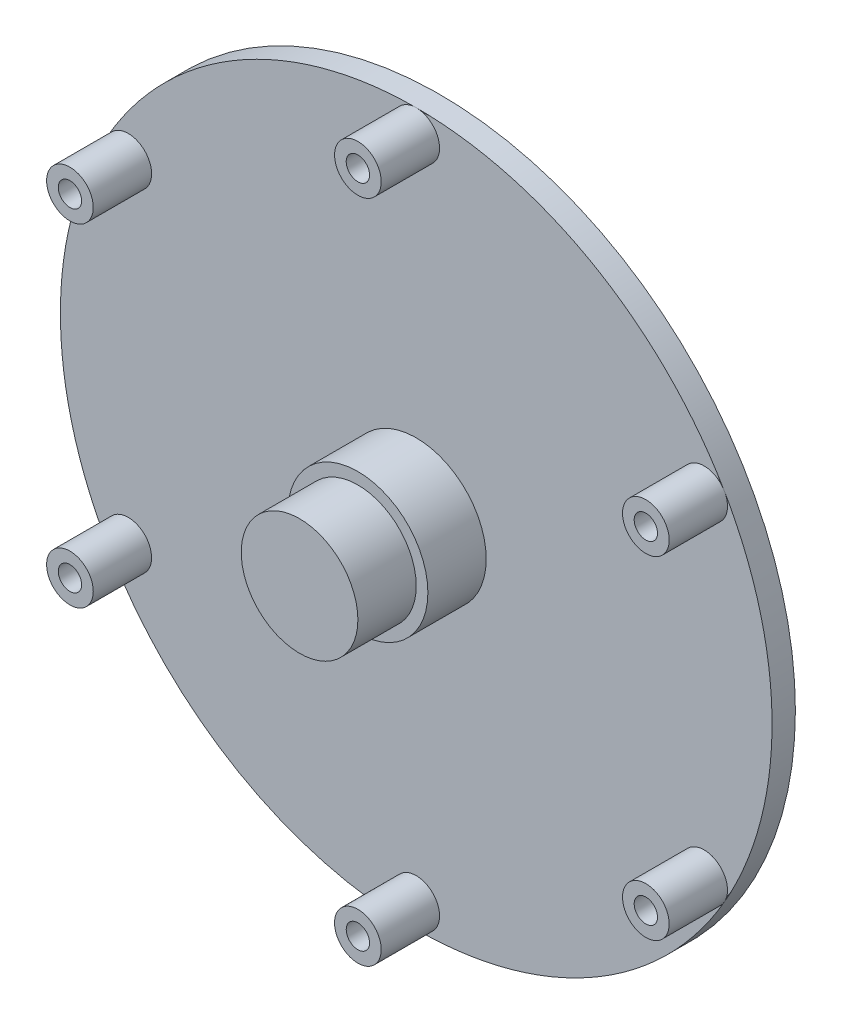
ISO-10303-21;
HEADER;
FILE_DESCRIPTION(('STEP AP214'),'2;1');
FILE_NAME('part.step','',(''),(''),'','','');
FILE_SCHEMA(('AUTOMOTIVE_DESIGN { 1 0 10303 214 1 1 1 1 }'));
ENDSEC;
DATA;
#1=APPLICATION_CONTEXT('core data for automotive mechanical design processes');
#2=APPLICATION_PROTOCOL_DEFINITION('international standard','automotive_design',2000,#1);
#3=PRODUCT_CONTEXT('',#1,'mechanical');
#4=PRODUCT('Part','Part','',(#3));
#5=PRODUCT_RELATED_PRODUCT_CATEGORY('part','',(#4));
#6=PRODUCT_DEFINITION_FORMATION('','',#4);
#7=PRODUCT_DEFINITION_CONTEXT('part definition',#1,'design');
#8=PRODUCT_DEFINITION('design','',#6,#7);
#9=PRODUCT_DEFINITION_SHAPE('','',#8);
#10=(LENGTH_UNIT() NAMED_UNIT(*) SI_UNIT(.MILLI.,.METRE.));
#11=(NAMED_UNIT(*) PLANE_ANGLE_UNIT() SI_UNIT($,.RADIAN.));
#12=(NAMED_UNIT(*) SI_UNIT($,.STERADIAN.) SOLID_ANGLE_UNIT());
#13=UNCERTAINTY_MEASURE_WITH_UNIT(LENGTH_MEASURE(1.E-05),#10,'distance_accuracy_value','');
#14=(GEOMETRIC_REPRESENTATION_CONTEXT(3) GLOBAL_UNCERTAINTY_ASSIGNED_CONTEXT((#13)) GLOBAL_UNIT_ASSIGNED_CONTEXT((#10,
#11,#12)) REPRESENTATION_CONTEXT('',''));
#15=CARTESIAN_POINT('',(0.,0.,0.));
#16=DIRECTION('',(0.,0.,1.));
#17=DIRECTION('',(1.,0.,0.));
#18=AXIS2_PLACEMENT_3D('',#15,#16,#17);
#19=CARTESIAN_POINT('',(0.,0.,2.));
#20=DIRECTION('',(0.,0.,1.));
#21=DIRECTION('',(1.,0.,0.));
#22=AXIS2_PLACEMENT_3D('',#19,#20,#21);
#23=PLANE('',#22);
#24=CARTESIAN_POINT('',(0.,0.,2.));
#25=DIRECTION('',(0.,0.,1.));
#26=DIRECTION('',(1.,0.,0.));
#27=AXIS2_PLACEMENT_3D('',#24,#25,#26);
#28=CIRCLE('',#27,6.);
#29=CARTESIAN_POINT('',(6.,0.,2.));
#30=VERTEX_POINT('',#29);
#31=EDGE_CURVE('E321',#30,#30,#28,.T.);
#32=ORIENTED_EDGE('',*,*,#31,.F.);
#33=EDGE_LOOP('',(#32));
#34=FACE_BOUND('',#33,.T.);
#35=CARTESIAN_POINT('',(0.,0.,2.));
#36=DIRECTION('',(0.,0.,1.));
#37=DIRECTION('',(1.,0.,0.));
#38=AXIS2_PLACEMENT_3D('',#35,#36,#37);
#39=CIRCLE('',#38,30.5);
#40=CARTESIAN_POINT('',(0.,30.5,2.));
#41=VERTEX_POINT('',#40);
#42=CARTESIAN_POINT('',(-26.4137748154252,15.2500000000003,2.));
#43=VERTEX_POINT('',#42);
#44=EDGE_CURVE('E122',#41,#43,#39,.T.);
#45=ORIENTED_EDGE('',*,*,#44,.T.);
#46=CARTESIAN_POINT('',(-24.6817240078563,14.2500000000003,2.));
#47=DIRECTION('',(0.,0.,1.));
#48=DIRECTION('',(0.50000000000001,0.866025403784433,0.));
#49=AXIS2_PLACEMENT_3D('',#46,#47,#48);
#50=CIRCLE('',#49,2.);
#51=EDGE_CURVE('E88',#43,#43,#50,.T.);
#52=ORIENTED_EDGE('',*,*,#51,.F.);
#53=CARTESIAN_POINT('',(-26.4137748154255,-15.2499999999998,2.));
#54=VERTEX_POINT('',#53);
#55=EDGE_CURVE('E94',#43,#54,#39,.T.);
#56=ORIENTED_EDGE('',*,*,#55,.T.);
#57=CARTESIAN_POINT('',(-24.6817240078566,-14.2499999999998,2.));
#58=DIRECTION('',(0.,0.,1.));
#59=DIRECTION('',(-0.499999999999992,0.866025403784443,0.));
#60=AXIS2_PLACEMENT_3D('',#57,#58,#59);
#61=CIRCLE('',#60,2.);
#62=EDGE_CURVE('E182',#54,#54,#61,.T.);
#63=ORIENTED_EDGE('',*,*,#62,.F.);
#64=CARTESIAN_POINT('',(0.,-30.5,2.));
#65=VERTEX_POINT('',#64);
#66=EDGE_CURVE('E617',#54,#65,#39,.T.);
#67=ORIENTED_EDGE('',*,*,#66,.T.);
#68=CARTESIAN_POINT('',(0.,-28.5,2.));
#69=DIRECTION('',(0.,0.,1.));
#70=DIRECTION('',(-1.,0.,0.));
#71=AXIS2_PLACEMENT_3D('',#68,#69,#70);
#72=CIRCLE('',#71,2.);
#73=EDGE_CURVE('E193',#65,#65,#72,.T.);
#74=ORIENTED_EDGE('',*,*,#73,.F.);
#75=CARTESIAN_POINT('',(26.4137748154253,-15.2500000000001,2.));
#76=VERTEX_POINT('',#75);
#77=EDGE_CURVE('E616',#65,#76,#39,.T.);
#78=ORIENTED_EDGE('',*,*,#77,.T.);
#79=CARTESIAN_POINT('',(24.6817240078564,-14.2500000000001,2.));
#80=DIRECTION('',(0.,0.,1.));
#81=DIRECTION('',(-0.500000000000004,-0.866025403784436,0.));
#82=AXIS2_PLACEMENT_3D('',#79,#80,#81);
#83=CIRCLE('',#82,2.);
#84=EDGE_CURVE('E205',#76,#76,#83,.T.);
#85=ORIENTED_EDGE('',*,*,#84,.F.);
#86=CARTESIAN_POINT('',(26.4137748154254,15.2499999999999,2.));
#87=VERTEX_POINT('',#86);
#88=EDGE_CURVE('E119',#76,#87,#39,.T.);
#89=ORIENTED_EDGE('',*,*,#88,.T.);
#90=CARTESIAN_POINT('',(24.6817240078565,14.2499999999999,2.));
#91=DIRECTION('',(0.,0.,1.));
#92=DIRECTION('',(0.499999999999998,-0.86602540378444,0.));
#93=AXIS2_PLACEMENT_3D('',#90,#91,#92);
#94=CIRCLE('',#93,2.);
#95=EDGE_CURVE('E116',#87,#87,#94,.T.);
#96=ORIENTED_EDGE('',*,*,#95,.F.);
#97=EDGE_CURVE('E110',#87,#41,#39,.T.);
#98=ORIENTED_EDGE('',*,*,#97,.T.);
#99=CARTESIAN_POINT('',(0.,28.5,2.));
#100=DIRECTION('',(0.,0.,1.));
#101=DIRECTION('',(1.,0.,0.));
#102=AXIS2_PLACEMENT_3D('',#99,#100,#101);
#103=CIRCLE('',#102,2.);
#104=EDGE_CURVE('E113',#41,#41,#103,.T.);
#105=ORIENTED_EDGE('',*,*,#104,.F.);
#106=EDGE_LOOP('',(#45,#52,#56,#63,#67,#74,#78,#85,#89,#96,#98,#105));
#107=FACE_BOUND('',#106,.T.);
#108=ADVANCED_FACE('F75',(#34,#107),#23,.T.);
#109=CARTESIAN_POINT('',(0.,0.,2.));
#110=DIRECTION('',(0.,0.,-1.));
#111=DIRECTION('',(-1.,0.,0.));
#112=AXIS2_PLACEMENT_3D('',#109,#110,#111);
#113=CYLINDRICAL_SURFACE('',#112,30.5);
#114=ORIENTED_EDGE('',*,*,#44,.F.);
#115=ORIENTED_EDGE('',*,*,#97,.F.);
#116=ORIENTED_EDGE('',*,*,#88,.F.);
#117=ORIENTED_EDGE('',*,*,#77,.F.);
#118=ORIENTED_EDGE('',*,*,#66,.F.);
#119=ORIENTED_EDGE('',*,*,#55,.F.);
#120=EDGE_LOOP('',(#114,#115,#116,#117,#118,#119));
#121=FACE_BOUND('',#120,.T.);
#122=CARTESIAN_POINT('',(0.,0.,0.));
#123=DIRECTION('',(0.,0.,1.));
#124=DIRECTION('',(1.,0.,0.));
#125=AXIS2_PLACEMENT_3D('',#122,#123,#124);
#126=CIRCLE('',#125,30.5);
#127=CARTESIAN_POINT('',(30.5,0.,0.));
#128=VERTEX_POINT('',#127);
#129=EDGE_CURVE('E120',#128,#128,#126,.T.);
#130=ORIENTED_EDGE('',*,*,#129,.T.);
#131=EDGE_LOOP('',(#130));
#132=FACE_BOUND('',#131,.T.);
#133=ADVANCED_FACE('F77',(#121,#132),#113,.T.);
#134=CARTESIAN_POINT('',(0.,0.,0.));
#135=DIRECTION('',(0.,0.,1.));
#136=DIRECTION('',(1.,0.,0.));
#137=AXIS2_PLACEMENT_3D('',#134,#135,#136);
#138=PLANE('',#137);
#139=CARTESIAN_POINT('',(0.,0.,0.));
#140=DIRECTION('',(0.,0.,1.));
#141=DIRECTION('',(1.,0.,0.));
#142=AXIS2_PLACEMENT_3D('',#139,#140,#141);
#143=CIRCLE('',#142,6.);
#144=CARTESIAN_POINT('',(6.,0.,0.));
#145=VERTEX_POINT('',#144);
#146=EDGE_CURVE('E83',#145,#145,#143,.F.);
#147=ORIENTED_EDGE('',*,*,#146,.F.);
#148=EDGE_LOOP('',(#147));
#149=FACE_BOUND('',#148,.T.);
#150=ORIENTED_EDGE('',*,*,#129,.F.);
#151=EDGE_LOOP('',(#150));
#152=FACE_BOUND('',#151,.T.);
#153=ADVANCED_FACE('F152',(#149,#152),#138,.F.);
#154=CARTESIAN_POINT('',(0.,28.5,7.));
#155=DIRECTION('',(0.,0.,1.));
#156=DIRECTION('',(1.,0.,0.));
#157=AXIS2_PLACEMENT_3D('',#154,#155,#156);
#158=PLANE('',#157);
#159=CARTESIAN_POINT('',(0.,28.5,7.));
#160=DIRECTION('',(0.,0.,1.));
#161=DIRECTION('',(1.,0.,0.));
#162=AXIS2_PLACEMENT_3D('',#159,#160,#161);
#163=CIRCLE('',#162,2.);
#164=CARTESIAN_POINT('',(2.,28.5,7.));
#165=VERTEX_POINT('',#164);
#166=EDGE_CURVE('E125',#165,#165,#163,.T.);
#167=ORIENTED_EDGE('',*,*,#166,.T.);
#168=EDGE_LOOP('',(#167));
#169=FACE_BOUND('',#168,.T.);
#170=CARTESIAN_POINT('',(0.,28.5,7.));
#171=DIRECTION('',(0.,0.,1.));
#172=DIRECTION('',(1.,0.,0.));
#173=AXIS2_PLACEMENT_3D('',#170,#171,#172);
#174=CIRCLE('',#173,1.);
#175=CARTESIAN_POINT('',(1.,28.5,7.));
#176=VERTEX_POINT('',#175);
#177=EDGE_CURVE('E126',#176,#176,#174,.T.);
#178=ORIENTED_EDGE('',*,*,#177,.F.);
#179=EDGE_LOOP('',(#178));
#180=FACE_BOUND('',#179,.T.);
#181=ADVANCED_FACE('F155',(#169,#180),#158,.T.);
#182=CARTESIAN_POINT('',(0.,28.5,7.));
#183=DIRECTION('',(0.,0.,-1.));
#184=DIRECTION('',(-1.,0.,0.));
#185=AXIS2_PLACEMENT_3D('',#182,#183,#184);
#186=CYLINDRICAL_SURFACE('',#185,2.);
#187=ORIENTED_EDGE('',*,*,#166,.F.);
#188=EDGE_LOOP('',(#187));
#189=FACE_BOUND('',#188,.T.);
#190=ORIENTED_EDGE('',*,*,#104,.T.);
#191=EDGE_LOOP('',(#190));
#192=FACE_BOUND('',#191,.T.);
#193=ADVANCED_FACE('F124',(#189,#192),#186,.T.);
#194=CARTESIAN_POINT('',(0.,28.5,7.));
#195=DIRECTION('',(0.,0.,-1.));
#196=DIRECTION('',(-1.,0.,0.));
#197=AXIS2_PLACEMENT_3D('',#194,#195,#196);
#198=CYLINDRICAL_SURFACE('',#197,1.);
#199=CARTESIAN_POINT('',(0.,28.5,3.5));
#200=DIRECTION('',(0.,0.,1.));
#201=DIRECTION('',(1.,0.,0.));
#202=AXIS2_PLACEMENT_3D('',#199,#200,#201);
#203=CIRCLE('',#202,1.);
#204=CARTESIAN_POINT('',(1.,28.5,3.5));
#205=VERTEX_POINT('',#204);
#206=EDGE_CURVE('E129',#205,#205,#203,.F.);
#207=ORIENTED_EDGE('',*,*,#206,.T.);
#208=EDGE_LOOP('',(#207));
#209=FACE_BOUND('',#208,.T.);
#210=ORIENTED_EDGE('',*,*,#177,.T.);
#211=EDGE_LOOP('',(#210));
#212=FACE_BOUND('',#211,.T.);
#213=ADVANCED_FACE('F271',(#209,#212),#198,.F.);
#214=CARTESIAN_POINT('',(0.,28.5,3.5));
#215=DIRECTION('',(0.,0.,1.));
#216=DIRECTION('',(1.,0.,0.));
#217=AXIS2_PLACEMENT_3D('',#214,#215,#216);
#218=PLANE('',#217);
#219=ORIENTED_EDGE('',*,*,#206,.F.);
#220=EDGE_LOOP('',(#219));
#221=FACE_BOUND('',#220,.T.);
#222=ADVANCED_FACE('F268',(#221),#218,.T.);
#223=CARTESIAN_POINT('',(24.6817240078565,14.2499999999999,7.));
#224=DIRECTION('',(0.,0.,1.));
#225=DIRECTION('',(1.,0.,0.));
#226=AXIS2_PLACEMENT_3D('',#223,#224,#225);
#227=PLANE('',#226);
#228=CARTESIAN_POINT('',(24.6817240078565,14.2499999999999,7.));
#229=DIRECTION('',(0.,0.,1.));
#230=DIRECTION('',(0.499999999999998,-0.86602540378444,0.));
#231=AXIS2_PLACEMENT_3D('',#228,#229,#230);
#232=CIRCLE('',#231,2.);
#233=CARTESIAN_POINT('',(25.6817240078565,12.5179491924311,7.));
#234=VERTEX_POINT('',#233);
#235=EDGE_CURVE('E217',#234,#234,#232,.T.);
#236=ORIENTED_EDGE('',*,*,#235,.T.);
#237=EDGE_LOOP('',(#236));
#238=FACE_BOUND('',#237,.T.);
#239=CARTESIAN_POINT('',(24.6817240078565,14.2499999999999,7.));
#240=DIRECTION('',(0.,0.,1.));
#241=DIRECTION('',(0.499999999999998,-0.86602540378444,0.));
#242=AXIS2_PLACEMENT_3D('',#239,#240,#241);
#243=CIRCLE('',#242,1.);
#244=CARTESIAN_POINT('',(25.1817240078565,13.3839745962155,7.));
#245=VERTEX_POINT('',#244);
#246=EDGE_CURVE('E214',#245,#245,#243,.T.);
#247=ORIENTED_EDGE('',*,*,#246,.F.);
#248=EDGE_LOOP('',(#247));
#249=FACE_BOUND('',#248,.T.);
#250=ADVANCED_FACE('F270',(#238,#249),#227,.T.);
#251=CARTESIAN_POINT('',(24.6817240078565,14.2499999999999,7.));
#252=DIRECTION('',(0.,0.,-1.));
#253=DIRECTION('',(-1.,0.,0.));
#254=AXIS2_PLACEMENT_3D('',#251,#252,#253);
#255=CYLINDRICAL_SURFACE('',#254,2.);
#256=ORIENTED_EDGE('',*,*,#235,.F.);
#257=EDGE_LOOP('',(#256));
#258=FACE_BOUND('',#257,.T.);
#259=ORIENTED_EDGE('',*,*,#95,.T.);
#260=EDGE_LOOP('',(#259));
#261=FACE_BOUND('',#260,.T.);
#262=ADVANCED_FACE('F240',(#258,#261),#255,.T.);
#263=CARTESIAN_POINT('',(24.6817240078565,14.2499999999999,7.));
#264=DIRECTION('',(0.,0.,-1.));
#265=DIRECTION('',(-1.,0.,0.));
#266=AXIS2_PLACEMENT_3D('',#263,#264,#265);
#267=CYLINDRICAL_SURFACE('',#266,1.);
#268=CARTESIAN_POINT('',(24.6817240078565,14.2499999999999,3.5));
#269=DIRECTION('',(0.,0.,1.));
#270=DIRECTION('',(1.,0.,0.));
#271=AXIS2_PLACEMENT_3D('',#268,#269,#270);
#272=CIRCLE('',#271,1.);
#273=CARTESIAN_POINT('',(25.6817240078565,14.2499999999999,3.5));
#274=VERTEX_POINT('',#273);
#275=EDGE_CURVE('E132',#274,#274,#272,.F.);
#276=ORIENTED_EDGE('',*,*,#275,.T.);
#277=EDGE_LOOP('',(#276));
#278=FACE_BOUND('',#277,.T.);
#279=ORIENTED_EDGE('',*,*,#246,.T.);
#280=EDGE_LOOP('',(#279));
#281=FACE_BOUND('',#280,.T.);
#282=ADVANCED_FACE('F224',(#278,#281),#267,.F.);
#283=CARTESIAN_POINT('',(24.6817240078563,14.2500000000003,3.5));
#284=DIRECTION('',(0.,0.,1.));
#285=DIRECTION('',(0.50000000000001,-0.866025403784433,0.));
#286=AXIS2_PLACEMENT_3D('',#283,#284,#285);
#287=PLANE('',#286);
#288=ORIENTED_EDGE('',*,*,#275,.F.);
#289=EDGE_LOOP('',(#288));
#290=FACE_BOUND('',#289,.T.);
#291=ADVANCED_FACE('F227',(#290),#287,.T.);
#292=CARTESIAN_POINT('',(24.6817240078564,-14.2500000000001,7.));
#293=DIRECTION('',(0.,0.,1.));
#294=DIRECTION('',(1.,0.,0.));
#295=AXIS2_PLACEMENT_3D('',#292,#293,#294);
#296=PLANE('',#295);
#297=CARTESIAN_POINT('',(24.6817240078564,-14.2500000000001,7.));
#298=DIRECTION('',(0.,0.,1.));
#299=DIRECTION('',(-0.500000000000004,-0.866025403784436,0.));
#300=AXIS2_PLACEMENT_3D('',#297,#298,#299);
#301=CIRCLE('',#300,2.);
#302=CARTESIAN_POINT('',(23.6817240078564,-15.982050807569,7.));
#303=VERTEX_POINT('',#302);
#304=EDGE_CURVE('E206',#303,#303,#301,.T.);
#305=ORIENTED_EDGE('',*,*,#304,.T.);
#306=EDGE_LOOP('',(#305));
#307=FACE_BOUND('',#306,.T.);
#308=CARTESIAN_POINT('',(24.6817240078564,-14.2500000000001,7.));
#309=DIRECTION('',(0.,0.,1.));
#310=DIRECTION('',(-0.500000000000004,-0.866025403784436,0.));
#311=AXIS2_PLACEMENT_3D('',#308,#309,#310);
#312=CIRCLE('',#311,1.);
#313=CARTESIAN_POINT('',(24.1817240078564,-15.1160254037846,7.));
#314=VERTEX_POINT('',#313);
#315=EDGE_CURVE('E202',#314,#314,#312,.T.);
#316=ORIENTED_EDGE('',*,*,#315,.F.);
#317=EDGE_LOOP('',(#316));
#318=FACE_BOUND('',#317,.T.);
#319=ADVANCED_FACE('F229',(#307,#318),#296,.T.);
#320=CARTESIAN_POINT('',(24.6817240078564,-14.2500000000001,7.));
#321=DIRECTION('',(0.,0.,-1.));
#322=DIRECTION('',(-1.,0.,0.));
#323=AXIS2_PLACEMENT_3D('',#320,#321,#322);
#324=CYLINDRICAL_SURFACE('',#323,2.);
#325=ORIENTED_EDGE('',*,*,#304,.F.);
#326=EDGE_LOOP('',(#325));
#327=FACE_BOUND('',#326,.T.);
#328=ORIENTED_EDGE('',*,*,#84,.T.);
#329=EDGE_LOOP('',(#328));
#330=FACE_BOUND('',#329,.T.);
#331=ADVANCED_FACE('F236',(#327,#330),#324,.T.);
#332=CARTESIAN_POINT('',(24.6817240078564,-14.2500000000001,7.));
#333=DIRECTION('',(0.,0.,-1.));
#334=DIRECTION('',(-1.,0.,0.));
#335=AXIS2_PLACEMENT_3D('',#332,#333,#334);
#336=CYLINDRICAL_SURFACE('',#335,1.);
#337=CARTESIAN_POINT('',(24.6817240078564,-14.2500000000001,3.5));
#338=DIRECTION('',(0.,0.,1.));
#339=DIRECTION('',(1.,0.,0.));
#340=AXIS2_PLACEMENT_3D('',#337,#338,#339);
#341=CIRCLE('',#340,1.);
#342=CARTESIAN_POINT('',(25.6817240078564,-14.2500000000001,3.5));
#343=VERTEX_POINT('',#342);
#344=EDGE_CURVE('E209',#343,#343,#341,.F.);
#345=ORIENTED_EDGE('',*,*,#344,.T.);
#346=EDGE_LOOP('',(#345));
#347=FACE_BOUND('',#346,.T.);
#348=ORIENTED_EDGE('',*,*,#315,.T.);
#349=EDGE_LOOP('',(#348));
#350=FACE_BOUND('',#349,.T.);
#351=ADVANCED_FACE('F249',(#347,#350),#336,.F.);
#352=CARTESIAN_POINT('',(24.6817240078566,-14.2499999999998,3.5));
#353=DIRECTION('',(0.,0.,1.));
#354=DIRECTION('',(-0.499999999999992,-0.866025403784443,0.));
#355=AXIS2_PLACEMENT_3D('',#352,#353,#354);
#356=PLANE('',#355);
#357=ORIENTED_EDGE('',*,*,#344,.F.);
#358=EDGE_LOOP('',(#357));
#359=FACE_BOUND('',#358,.T.);
#360=ADVANCED_FACE('F246',(#359),#356,.T.);
#361=CARTESIAN_POINT('',(0.,-28.5,7.));
#362=DIRECTION('',(0.,0.,1.));
#363=DIRECTION('',(1.,0.,0.));
#364=AXIS2_PLACEMENT_3D('',#361,#362,#363);
#365=PLANE('',#364);
#366=CARTESIAN_POINT('',(0.,-28.5,7.));
#367=DIRECTION('',(0.,0.,1.));
#368=DIRECTION('',(-1.,0.,0.));
#369=AXIS2_PLACEMENT_3D('',#366,#367,#368);
#370=CIRCLE('',#369,2.);
#371=CARTESIAN_POINT('',(-2.,-28.5,7.));
#372=VERTEX_POINT('',#371);
#373=EDGE_CURVE('E194',#372,#372,#370,.T.);
#374=ORIENTED_EDGE('',*,*,#373,.T.);
#375=EDGE_LOOP('',(#374));
#376=FACE_BOUND('',#375,.T.);
#377=CARTESIAN_POINT('',(0.,-28.5,7.));
#378=DIRECTION('',(0.,0.,1.));
#379=DIRECTION('',(-1.,0.,0.));
#380=AXIS2_PLACEMENT_3D('',#377,#378,#379);
#381=CIRCLE('',#380,1.);
#382=CARTESIAN_POINT('',(-1.,-28.5,7.));
#383=VERTEX_POINT('',#382);
#384=EDGE_CURVE('E190',#383,#383,#381,.T.);
#385=ORIENTED_EDGE('',*,*,#384,.F.);
#386=EDGE_LOOP('',(#385));
#387=FACE_BOUND('',#386,.T.);
#388=ADVANCED_FACE('F248',(#376,#387),#365,.T.);
#389=CARTESIAN_POINT('',(0.,-28.5,7.));
#390=DIRECTION('',(0.,0.,-1.));
#391=DIRECTION('',(-1.,0.,0.));
#392=AXIS2_PLACEMENT_3D('',#389,#390,#391);
#393=CYLINDRICAL_SURFACE('',#392,2.);
#394=ORIENTED_EDGE('',*,*,#373,.F.);
#395=EDGE_LOOP('',(#394));
#396=FACE_BOUND('',#395,.T.);
#397=ORIENTED_EDGE('',*,*,#73,.T.);
#398=EDGE_LOOP('',(#397));
#399=FACE_BOUND('',#398,.T.);
#400=ADVANCED_FACE('F361',(#396,#399),#393,.T.);
#401=CARTESIAN_POINT('',(0.,-28.5,7.));
#402=DIRECTION('',(0.,0.,-1.));
#403=DIRECTION('',(-1.,0.,0.));
#404=AXIS2_PLACEMENT_3D('',#401,#402,#403);
#405=CYLINDRICAL_SURFACE('',#404,1.);
#406=CARTESIAN_POINT('',(0.,-28.5,3.5));
#407=DIRECTION('',(0.,0.,1.));
#408=DIRECTION('',(1.,0.,0.));
#409=AXIS2_PLACEMENT_3D('',#406,#407,#408);
#410=CIRCLE('',#409,1.);
#411=CARTESIAN_POINT('',(1.,-28.5,3.5));
#412=VERTEX_POINT('',#411);
#413=EDGE_CURVE('E197',#412,#412,#410,.F.);
#414=ORIENTED_EDGE('',*,*,#413,.T.);
#415=EDGE_LOOP('',(#414));
#416=FACE_BOUND('',#415,.T.);
#417=ORIENTED_EDGE('',*,*,#384,.T.);
#418=EDGE_LOOP('',(#417));
#419=FACE_BOUND('',#418,.T.);
#420=ADVANCED_FACE('F255',(#416,#419),#405,.F.);
#421=CARTESIAN_POINT('',(0.,-28.5,3.5));
#422=DIRECTION('',(0.,0.,1.));
#423=DIRECTION('',(-1.,0.,0.));
#424=AXIS2_PLACEMENT_3D('',#421,#422,#423);
#425=PLANE('',#424);
#426=ORIENTED_EDGE('',*,*,#413,.F.);
#427=EDGE_LOOP('',(#426));
#428=FACE_BOUND('',#427,.T.);
#429=ADVANCED_FACE('F251',(#428),#425,.T.);
#430=CARTESIAN_POINT('',(-24.6817240078566,-14.2499999999998,7.));
#431=DIRECTION('',(0.,0.,1.));
#432=DIRECTION('',(1.,0.,0.));
#433=AXIS2_PLACEMENT_3D('',#430,#431,#432);
#434=PLANE('',#433);
#435=CARTESIAN_POINT('',(-24.6817240078566,-14.2499999999998,7.));
#436=DIRECTION('',(0.,0.,1.));
#437=DIRECTION('',(-0.499999999999992,0.866025403784443,0.));
#438=AXIS2_PLACEMENT_3D('',#435,#436,#437);
#439=CIRCLE('',#438,2.);
#440=CARTESIAN_POINT('',(-25.6817240078566,-12.5179491924309,7.));
#441=VERTEX_POINT('',#440);
#442=EDGE_CURVE('E183',#441,#441,#439,.T.);
#443=ORIENTED_EDGE('',*,*,#442,.T.);
#444=EDGE_LOOP('',(#443));
#445=FACE_BOUND('',#444,.T.);
#446=CARTESIAN_POINT('',(-24.6817240078566,-14.2499999999998,7.));
#447=DIRECTION('',(0.,0.,1.));
#448=DIRECTION('',(-0.499999999999992,0.866025403784443,0.));
#449=AXIS2_PLACEMENT_3D('',#446,#447,#448);
#450=CIRCLE('',#449,1.);
#451=CARTESIAN_POINT('',(-25.1817240078566,-13.3839745962153,7.));
#452=VERTEX_POINT('',#451);
#453=EDGE_CURVE('E179',#452,#452,#450,.T.);
#454=ORIENTED_EDGE('',*,*,#453,.F.);
#455=EDGE_LOOP('',(#454));
#456=FACE_BOUND('',#455,.T.);
#457=ADVANCED_FACE('F254',(#445,#456),#434,.T.);
#458=CARTESIAN_POINT('',(-24.6817240078566,-14.2499999999998,7.));
#459=DIRECTION('',(0.,0.,-1.));
#460=DIRECTION('',(-1.,0.,0.));
#461=AXIS2_PLACEMENT_3D('',#458,#459,#460);
#462=CYLINDRICAL_SURFACE('',#461,2.);
#463=ORIENTED_EDGE('',*,*,#442,.F.);
#464=EDGE_LOOP('',(#463));
#465=FACE_BOUND('',#464,.T.);
#466=ORIENTED_EDGE('',*,*,#62,.T.);
#467=EDGE_LOOP('',(#466));
#468=FACE_BOUND('',#467,.T.);
#469=ADVANCED_FACE('F351',(#465,#468),#462,.T.);
#470=CARTESIAN_POINT('',(-24.6817240078566,-14.2499999999998,7.));
#471=DIRECTION('',(0.,0.,-1.));
#472=DIRECTION('',(-1.,0.,0.));
#473=AXIS2_PLACEMENT_3D('',#470,#471,#472);
#474=CYLINDRICAL_SURFACE('',#473,1.);
#475=CARTESIAN_POINT('',(-24.6817240078566,-14.2499999999998,3.5));
#476=DIRECTION('',(0.,0.,1.));
#477=DIRECTION('',(1.,0.,0.));
#478=AXIS2_PLACEMENT_3D('',#475,#476,#477);
#479=CIRCLE('',#478,1.);
#480=CARTESIAN_POINT('',(-23.6817240078566,-14.2499999999998,3.5));
#481=VERTEX_POINT('',#480);
#482=EDGE_CURVE('E186',#481,#481,#479,.F.);
#483=ORIENTED_EDGE('',*,*,#482,.T.);
#484=EDGE_LOOP('',(#483));
#485=FACE_BOUND('',#484,.T.);
#486=ORIENTED_EDGE('',*,*,#453,.T.);
#487=EDGE_LOOP('',(#486));
#488=FACE_BOUND('',#487,.T.);
#489=ADVANCED_FACE('F261',(#485,#488),#474,.F.);
#490=CARTESIAN_POINT('',(-24.6817240078564,-14.2500000000001,3.5));
#491=DIRECTION('',(0.,0.,1.));
#492=DIRECTION('',(-0.500000000000004,0.866025403784436,0.));
#493=AXIS2_PLACEMENT_3D('',#490,#491,#492);
#494=PLANE('',#493);
#495=ORIENTED_EDGE('',*,*,#482,.F.);
#496=EDGE_LOOP('',(#495));
#497=FACE_BOUND('',#496,.T.);
#498=ADVANCED_FACE('F257',(#497),#494,.T.);
#499=CARTESIAN_POINT('',(-24.6817240078563,14.2500000000003,7.));
#500=DIRECTION('',(0.,0.,1.));
#501=DIRECTION('',(1.,0.,0.));
#502=AXIS2_PLACEMENT_3D('',#499,#500,#501);
#503=PLANE('',#502);
#504=CARTESIAN_POINT('',(-24.6817240078563,14.2500000000003,7.));
#505=DIRECTION('',(0.,0.,1.));
#506=DIRECTION('',(0.50000000000001,0.866025403784433,0.));
#507=AXIS2_PLACEMENT_3D('',#504,#505,#506);
#508=CIRCLE('',#507,2.);
#509=CARTESIAN_POINT('',(-23.6817240078563,15.9820508075692,7.));
#510=VERTEX_POINT('',#509);
#511=EDGE_CURVE('E167',#510,#510,#508,.T.);
#512=ORIENTED_EDGE('',*,*,#511,.T.);
#513=EDGE_LOOP('',(#512));
#514=FACE_BOUND('',#513,.T.);
#515=CARTESIAN_POINT('',(-24.6817240078563,14.2500000000003,7.));
#516=DIRECTION('',(0.,0.,1.));
#517=DIRECTION('',(0.50000000000001,0.866025403784433,0.));
#518=AXIS2_PLACEMENT_3D('',#515,#516,#517);
#519=CIRCLE('',#518,1.);
#520=CARTESIAN_POINT('',(-24.1817240078563,15.1160254037847,7.));
#521=VERTEX_POINT('',#520);
#522=EDGE_CURVE('E168',#521,#521,#519,.T.);
#523=ORIENTED_EDGE('',*,*,#522,.F.);
#524=EDGE_LOOP('',(#523));
#525=FACE_BOUND('',#524,.T.);
#526=ADVANCED_FACE('F260',(#514,#525),#503,.T.);
#527=CARTESIAN_POINT('',(-24.6817240078563,14.2500000000003,7.));
#528=DIRECTION('',(0.,0.,-1.));
#529=DIRECTION('',(-1.,0.,0.));
#530=AXIS2_PLACEMENT_3D('',#527,#528,#529);
#531=CYLINDRICAL_SURFACE('',#530,2.);
#532=ORIENTED_EDGE('',*,*,#511,.F.);
#533=EDGE_LOOP('',(#532));
#534=FACE_BOUND('',#533,.T.);
#535=ORIENTED_EDGE('',*,*,#51,.T.);
#536=EDGE_LOOP('',(#535));
#537=FACE_BOUND('',#536,.T.);
#538=ADVANCED_FACE('F341',(#534,#537),#531,.T.);
#539=CARTESIAN_POINT('',(-24.6817240078563,14.2500000000003,7.));
#540=DIRECTION('',(0.,0.,-1.));
#541=DIRECTION('',(-1.,0.,0.));
#542=AXIS2_PLACEMENT_3D('',#539,#540,#541);
#543=CYLINDRICAL_SURFACE('',#542,1.);
#544=CARTESIAN_POINT('',(-24.6817240078563,14.2500000000003,3.5));
#545=DIRECTION('',(0.,0.,1.));
#546=DIRECTION('',(1.,0.,0.));
#547=AXIS2_PLACEMENT_3D('',#544,#545,#546);
#548=CIRCLE('',#547,1.);
#549=CARTESIAN_POINT('',(-23.6817240078563,14.2500000000003,3.5));
#550=VERTEX_POINT('',#549);
#551=EDGE_CURVE('E171',#550,#550,#548,.F.);
#552=ORIENTED_EDGE('',*,*,#551,.T.);
#553=EDGE_LOOP('',(#552));
#554=FACE_BOUND('',#553,.T.);
#555=ORIENTED_EDGE('',*,*,#522,.T.);
#556=EDGE_LOOP('',(#555));
#557=FACE_BOUND('',#556,.T.);
#558=ADVANCED_FACE('F266',(#554,#557),#543,.F.);
#559=CARTESIAN_POINT('',(-24.6817240078565,14.2499999999999,3.5));
#560=DIRECTION('',(0.,0.,1.));
#561=DIRECTION('',(0.499999999999998,0.86602540378444,0.));
#562=AXIS2_PLACEMENT_3D('',#559,#560,#561);
#563=PLANE('',#562);
#564=ORIENTED_EDGE('',*,*,#551,.F.);
#565=EDGE_LOOP('',(#564));
#566=FACE_BOUND('',#565,.T.);
#567=ADVANCED_FACE('F263',(#566),#563,.T.);
#568=CARTESIAN_POINT('',(0.,0.,-1.));
#569=DIRECTION('',(0.,0.,1.));
#570=DIRECTION('',(1.,0.,0.));
#571=AXIS2_PLACEMENT_3D('',#568,#569,#570);
#572=CYLINDRICAL_SURFACE('',#571,6.);
#573=CARTESIAN_POINT('',(0.,0.,-1.));
#574=DIRECTION('',(0.,0.,-1.));
#575=DIRECTION('',(-1.,0.,0.));
#576=AXIS2_PLACEMENT_3D('',#573,#574,#575);
#577=CIRCLE('',#576,6.);
#578=CARTESIAN_POINT('',(-6.,0.,-1.));
#579=VERTEX_POINT('',#578);
#580=EDGE_CURVE('E174',#579,#579,#577,.T.);
#581=ORIENTED_EDGE('',*,*,#580,.F.);
#582=EDGE_LOOP('',(#581));
#583=FACE_BOUND('',#582,.T.);
#584=ORIENTED_EDGE('',*,*,#146,.T.);
#585=EDGE_LOOP('',(#584));
#586=FACE_BOUND('',#585,.T.);
#587=ADVANCED_FACE('F150',(#583,#586),#572,.T.);
#588=CARTESIAN_POINT('',(0.,0.,-1.));
#589=DIRECTION('',(0.,0.,-1.));
#590=DIRECTION('',(-1.,0.,0.));
#591=AXIS2_PLACEMENT_3D('',#588,#589,#590);
#592=PLANE('',#591);
#593=CARTESIAN_POINT('',(0.,0.,-1.));
#594=DIRECTION('',(0.,0.,-1.));
#595=DIRECTION('',(-1.,0.,0.));
#596=AXIS2_PLACEMENT_3D('',#593,#594,#595);
#597=CIRCLE('',#596,5.);
#598=CARTESIAN_POINT('',(-5.,0.,-1.));
#599=VERTEX_POINT('',#598);
#600=EDGE_CURVE('E143',#599,#599,#597,.F.);
#601=ORIENTED_EDGE('',*,*,#600,.T.);
#602=EDGE_LOOP('',(#601));
#603=FACE_BOUND('',#602,.T.);
#604=ORIENTED_EDGE('',*,*,#580,.T.);
#605=EDGE_LOOP('',(#604));
#606=FACE_BOUND('',#605,.T.);
#607=ADVANCED_FACE('F299',(#603,#606),#592,.T.);
#608=CARTESIAN_POINT('',(0.,0.,-18.));
#609=DIRECTION('',(0.,0.,1.));
#610=DIRECTION('',(1.,0.,0.));
#611=AXIS2_PLACEMENT_3D('',#608,#609,#610);
#612=PLANE('',#611);
#613=CARTESIAN_POINT('',(0.,0.,-18.));
#614=DIRECTION('',(0.,0.,-1.));
#615=DIRECTION('',(-1.,0.,0.));
#616=AXIS2_PLACEMENT_3D('',#613,#614,#615);
#617=CIRCLE('',#616,3.);
#618=CARTESIAN_POINT('',(-3.,0.,-18.));
#619=VERTEX_POINT('',#618);
#620=EDGE_CURVE('E314',#619,#619,#617,.T.);
#621=ORIENTED_EDGE('',*,*,#620,.F.);
#622=EDGE_LOOP('',(#621));
#623=FACE_BOUND('',#622,.T.);
#624=CARTESIAN_POINT('',(0.,0.,-18.));
#625=DIRECTION('',(0.,0.,1.));
#626=DIRECTION('',(1.,0.,0.));
#627=AXIS2_PLACEMENT_3D('',#624,#625,#626);
#628=CIRCLE('',#627,5.);
#629=CARTESIAN_POINT('',(5.,0.,-18.));
#630=VERTEX_POINT('',#629);
#631=EDGE_CURVE('E140',#630,#630,#628,.T.);
#632=ORIENTED_EDGE('',*,*,#631,.F.);
#633=EDGE_LOOP('',(#632));
#634=FACE_BOUND('',#633,.T.);
#635=ADVANCED_FACE('F296',(#623,#634),#612,.F.);
#636=CARTESIAN_POINT('',(0.,0.,-18.));
#637=DIRECTION('',(0.,0.,1.));
#638=DIRECTION('',(1.,0.,0.));
#639=AXIS2_PLACEMENT_3D('',#636,#637,#638);
#640=CYLINDRICAL_SURFACE('',#639,5.);
#641=ORIENTED_EDGE('',*,*,#600,.F.);
#642=EDGE_LOOP('',(#641));
#643=FACE_BOUND('',#642,.T.);
#644=ORIENTED_EDGE('',*,*,#631,.T.);
#645=EDGE_LOOP('',(#644));
#646=FACE_BOUND('',#645,.T.);
#647=ADVANCED_FACE('F298',(#643,#646),#640,.T.);
#648=CARTESIAN_POINT('',(0.,0.,7.));
#649=DIRECTION('',(0.,0.,-1.));
#650=DIRECTION('',(-1.,0.,0.));
#651=AXIS2_PLACEMENT_3D('',#648,#649,#650);
#652=CYLINDRICAL_SURFACE('',#651,6.);
#653=CARTESIAN_POINT('',(0.,0.,7.));
#654=DIRECTION('',(0.,0.,1.));
#655=DIRECTION('',(1.,0.,0.));
#656=AXIS2_PLACEMENT_3D('',#653,#654,#655);
#657=CIRCLE('',#656,6.);
#658=CARTESIAN_POINT('',(6.,0.,7.));
#659=VERTEX_POINT('',#658);
#660=EDGE_CURVE('E324',#659,#659,#657,.T.);
#661=ORIENTED_EDGE('',*,*,#660,.F.);
#662=EDGE_LOOP('',(#661));
#663=FACE_BOUND('',#662,.T.);
#664=ORIENTED_EDGE('',*,*,#31,.T.);
#665=EDGE_LOOP('',(#664));
#666=FACE_BOUND('',#665,.T.);
#667=ADVANCED_FACE('F306',(#663,#666),#652,.T.);
#668=CARTESIAN_POINT('',(0.,0.,7.));
#669=DIRECTION('',(0.,0.,1.));
#670=DIRECTION('',(1.,0.,0.));
#671=AXIS2_PLACEMENT_3D('',#668,#669,#670);
#672=PLANE('',#671);
#673=CARTESIAN_POINT('',(0.,0.,7.));
#674=DIRECTION('',(0.,0.,1.));
#675=DIRECTION('',(1.,0.,0.));
#676=AXIS2_PLACEMENT_3D('',#673,#674,#675);
#677=CIRCLE('',#676,5.);
#678=CARTESIAN_POINT('',(5.,0.,7.));
#679=VERTEX_POINT('',#678);
#680=EDGE_CURVE('E12',#679,#679,#677,.F.);
#681=ORIENTED_EDGE('',*,*,#680,.T.);
#682=EDGE_LOOP('',(#681));
#683=FACE_BOUND('',#682,.T.);
#684=ORIENTED_EDGE('',*,*,#660,.T.);
#685=EDGE_LOOP('',(#684));
#686=FACE_BOUND('',#685,.T.);
#687=ADVANCED_FACE('F294',(#683,#686),#672,.T.);
#688=CARTESIAN_POINT('',(0.,0.,12.));
#689=DIRECTION('',(0.,0.,1.));
#690=DIRECTION('',(1.,0.,0.));
#691=AXIS2_PLACEMENT_3D('',#688,#689,#690);
#692=PLANE('',#691);
#693=CARTESIAN_POINT('',(0.,0.,12.));
#694=DIRECTION('',(0.,0.,1.));
#695=DIRECTION('',(1.,0.,0.));
#696=AXIS2_PLACEMENT_3D('',#693,#694,#695);
#697=CIRCLE('',#696,5.);
#698=CARTESIAN_POINT('',(5.,0.,12.));
#699=VERTEX_POINT('',#698);
#700=EDGE_CURVE('E137',#699,#699,#697,.T.);
#701=ORIENTED_EDGE('',*,*,#700,.T.);
#702=EDGE_LOOP('',(#701));
#703=FACE_BOUND('',#702,.T.);
#704=ADVANCED_FACE('F293',(#703),#692,.T.);
#705=ORIENTED_EDGE('',*,*,#680,.F.);
#706=EDGE_LOOP('',(#705));
#707=FACE_BOUND('',#706,.T.);
#708=ORIENTED_EDGE('',*,*,#700,.F.);
#709=EDGE_LOOP('',(#708));
#710=FACE_BOUND('',#709,.T.);
#711=ADVANCED_FACE('F244',(#707,#710),#640,.T.);
#712=CARTESIAN_POINT('',(0.,0.,-10.));
#713=DIRECTION('',(0.,0.,-1.));
#714=DIRECTION('',(-1.,0.,0.));
#715=AXIS2_PLACEMENT_3D('',#712,#713,#714);
#716=CYLINDRICAL_SURFACE('',#715,3.);
#717=CARTESIAN_POINT('',(0.,0.,-10.));
#718=DIRECTION('',(0.,0.,-1.));
#719=DIRECTION('',(-1.,0.,0.));
#720=AXIS2_PLACEMENT_3D('',#717,#718,#719);
#721=CIRCLE('',#720,3.);
#722=CARTESIAN_POINT('',(-3.,0.,-10.));
#723=VERTEX_POINT('',#722);
#724=EDGE_CURVE('E318',#723,#723,#721,.T.);
#725=ORIENTED_EDGE('',*,*,#724,.F.);
#726=EDGE_LOOP('',(#725));
#727=FACE_BOUND('',#726,.T.);
#728=ORIENTED_EDGE('',*,*,#620,.T.);
#729=EDGE_LOOP('',(#728));
#730=FACE_BOUND('',#729,.T.);
#731=ADVANCED_FACE('F508',(#727,#730),#716,.F.);
#732=CARTESIAN_POINT('',(0.,0.,-10.));
#733=DIRECTION('',(0.,0.,-1.));
#734=DIRECTION('',(-1.,0.,0.));
#735=AXIS2_PLACEMENT_3D('',#732,#733,#734);
#736=PLANE('',#735);
#737=ORIENTED_EDGE('',*,*,#724,.T.);
#738=EDGE_LOOP('',(#737));
#739=FACE_BOUND('',#738,.T.);
#740=ADVANCED_FACE('F585',(#739),#736,.T.);
#741=CLOSED_SHELL('',(#108,#133,#153,#181,#193,#213,#222,#250,#262,#282,#291,#319,#331,#351,
#360,#388,#400,#420,#429,#457,#469,#489,#498,#526,#538,#558,#567,#587,#607,#635,#647,#667,#687,
#704,#711,#731,#740));
#742=MANIFOLD_SOLID_BREP('B2',#741);
#743=ADVANCED_BREP_SHAPE_REPRESENTATION('',(#18,#742),#14);
#744=SHAPE_DEFINITION_REPRESENTATION(#9,#743);
ENDSEC;
END-ISO-10303-21;
